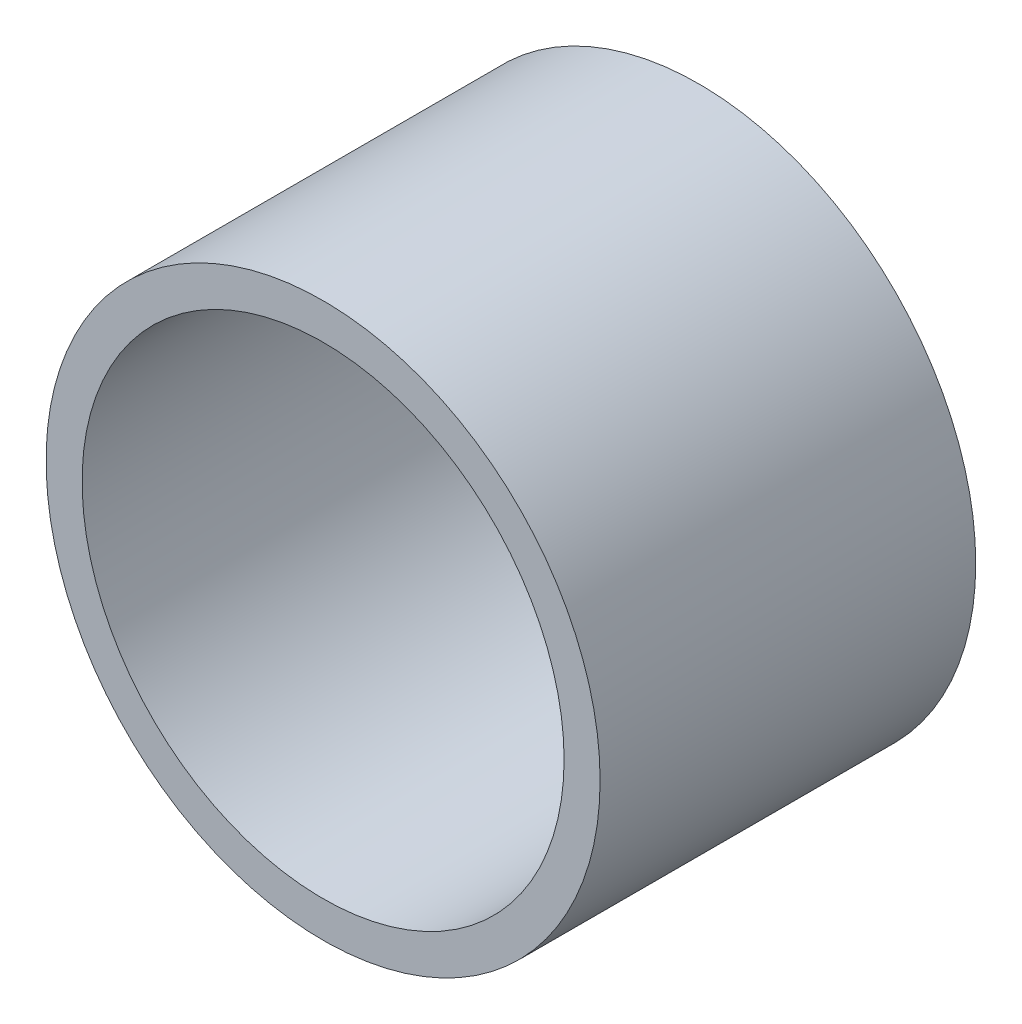
ISO-10303-21;
HEADER;
FILE_DESCRIPTION(('STEP AP214'),'2;1');
FILE_NAME('part.step','',(''),(''),'','','');
FILE_SCHEMA(('AUTOMOTIVE_DESIGN { 1 0 10303 214 1 1 1 1 }'));
ENDSEC;
DATA;
#1=APPLICATION_CONTEXT('core data for automotive mechanical design processes');
#2=APPLICATION_PROTOCOL_DEFINITION('international standard','automotive_design',2000,#1);
#3=PRODUCT_CONTEXT('',#1,'mechanical');
#4=PRODUCT('Part','Part','',(#3));
#5=PRODUCT_RELATED_PRODUCT_CATEGORY('part','',(#4));
#6=PRODUCT_DEFINITION_FORMATION('','',#4);
#7=PRODUCT_DEFINITION_CONTEXT('part definition',#1,'design');
#8=PRODUCT_DEFINITION('design','',#6,#7);
#9=PRODUCT_DEFINITION_SHAPE('','',#8);
#10=(LENGTH_UNIT() NAMED_UNIT(*) SI_UNIT(.MILLI.,.METRE.));
#11=(NAMED_UNIT(*) PLANE_ANGLE_UNIT() SI_UNIT($,.RADIAN.));
#12=(NAMED_UNIT(*) SI_UNIT($,.STERADIAN.) SOLID_ANGLE_UNIT());
#13=UNCERTAINTY_MEASURE_WITH_UNIT(LENGTH_MEASURE(1.E-05),#10,'distance_accuracy_value','');
#14=(GEOMETRIC_REPRESENTATION_CONTEXT(3) GLOBAL_UNCERTAINTY_ASSIGNED_CONTEXT((#13)) GLOBAL_UNIT_ASSIGNED_CONTEXT((#10,
#11,#12)) REPRESENTATION_CONTEXT('',''));
#15=CARTESIAN_POINT('',(0.,0.,0.));
#16=DIRECTION('',(0.,0.,1.));
#17=DIRECTION('',(1.,0.,0.));
#18=AXIS2_PLACEMENT_3D('',#15,#16,#17);
#19=CARTESIAN_POINT('',(0.,0.,67.8));
#20=DIRECTION('',(0.,0.,1.));
#21=DIRECTION('',(1.,0.,0.));
#22=AXIS2_PLACEMENT_3D('',#19,#20,#21);
#23=PLANE('',#22);
#24=CARTESIAN_POINT('',(0.,0.,67.8));
#25=DIRECTION('',(0.,0.,1.));
#26=DIRECTION('',(1.,0.,0.));
#27=AXIS2_PLACEMENT_3D('',#24,#25,#26);
#28=CIRCLE('',#27,50.);
#29=CARTESIAN_POINT('',(50.,0.,67.8));
#30=VERTEX_POINT('',#29);
#31=EDGE_CURVE('E10',#30,#30,#28,.T.);
#32=ORIENTED_EDGE('',*,*,#31,.T.);
#33=EDGE_LOOP('',(#32));
#34=FACE_BOUND('',#33,.T.);
#35=CARTESIAN_POINT('',(0.,0.,67.8));
#36=DIRECTION('',(0.,0.,1.));
#37=DIRECTION('',(1.,0.,0.));
#38=AXIS2_PLACEMENT_3D('',#35,#36,#37);
#39=CIRCLE('',#38,43.5);
#40=CARTESIAN_POINT('',(43.5,0.,67.8));
#41=VERTEX_POINT('',#40);
#42=EDGE_CURVE('E42',#41,#41,#39,.T.);
#43=ORIENTED_EDGE('',*,*,#42,.F.);
#44=EDGE_LOOP('',(#43));
#45=FACE_BOUND('',#44,.T.);
#46=ADVANCED_FACE('F31',(#34,#45),#23,.T.);
#47=CARTESIAN_POINT('',(0.,0.,0.));
#48=DIRECTION('',(0.,0.,1.));
#49=DIRECTION('',(1.,0.,0.));
#50=AXIS2_PLACEMENT_3D('',#47,#48,#49);
#51=PLANE('',#50);
#52=CARTESIAN_POINT('',(0.,0.,0.));
#53=DIRECTION('',(0.,0.,1.));
#54=DIRECTION('',(1.,0.,0.));
#55=AXIS2_PLACEMENT_3D('',#52,#53,#54);
#56=CIRCLE('',#55,50.);
#57=CARTESIAN_POINT('',(50.,0.,0.));
#58=VERTEX_POINT('',#57);
#59=EDGE_CURVE('E35',#58,#58,#56,.T.);
#60=ORIENTED_EDGE('',*,*,#59,.F.);
#61=EDGE_LOOP('',(#60));
#62=FACE_BOUND('',#61,.T.);
#63=CARTESIAN_POINT('',(0.,0.,0.));
#64=DIRECTION('',(0.,0.,1.));
#65=DIRECTION('',(1.,0.,0.));
#66=AXIS2_PLACEMENT_3D('',#63,#64,#65);
#67=CIRCLE('',#66,43.5);
#68=CARTESIAN_POINT('',(43.5,0.,0.));
#69=VERTEX_POINT('',#68);
#70=EDGE_CURVE('E44',#69,#69,#67,.T.);
#71=ORIENTED_EDGE('',*,*,#70,.T.);
#72=EDGE_LOOP('',(#71));
#73=FACE_BOUND('',#72,.T.);
#74=ADVANCED_FACE('F54',(#62,#73),#51,.F.);
#75=CARTESIAN_POINT('',(0.,0.,67.8));
#76=DIRECTION('',(0.,0.,-1.));
#77=DIRECTION('',(-1.,0.,0.));
#78=AXIS2_PLACEMENT_3D('',#75,#76,#77);
#79=CYLINDRICAL_SURFACE('',#78,50.);
#80=ORIENTED_EDGE('',*,*,#31,.F.);
#81=EDGE_LOOP('',(#80));
#82=FACE_BOUND('',#81,.T.);
#83=ORIENTED_EDGE('',*,*,#59,.T.);
#84=EDGE_LOOP('',(#83));
#85=FACE_BOUND('',#84,.T.);
#86=ADVANCED_FACE('F33',(#82,#85),#79,.T.);
#87=CARTESIAN_POINT('',(0.,0.,67.8));
#88=DIRECTION('',(0.,0.,-1.));
#89=DIRECTION('',(-1.,0.,0.));
#90=AXIS2_PLACEMENT_3D('',#87,#88,#89);
#91=CYLINDRICAL_SURFACE('',#90,43.5);
#92=ORIENTED_EDGE('',*,*,#42,.T.);
#93=EDGE_LOOP('',(#92));
#94=FACE_BOUND('',#93,.T.);
#95=ORIENTED_EDGE('',*,*,#70,.F.);
#96=EDGE_LOOP('',(#95));
#97=FACE_BOUND('',#96,.T.);
#98=ADVANCED_FACE('F50',(#94,#97),#91,.F.);
#99=CLOSED_SHELL('',(#46,#74,#86,#98));
#100=MANIFOLD_SOLID_BREP('B2',#99);
#101=ADVANCED_BREP_SHAPE_REPRESENTATION('',(#18,#100),#14);
#102=SHAPE_DEFINITION_REPRESENTATION(#9,#101);
ENDSEC;
END-ISO-10303-21;
